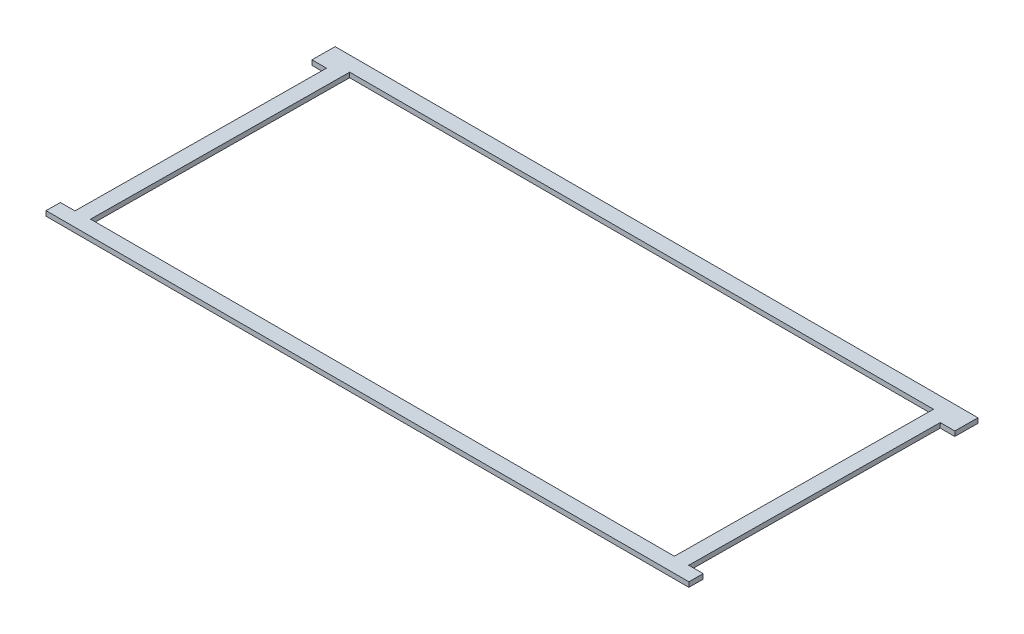
ISO-10303-21;
HEADER;
FILE_DESCRIPTION(('STEP AP214'),'2;1');
FILE_NAME('part.step','',(''),(''),'','','');
FILE_SCHEMA(('AUTOMOTIVE_DESIGN { 1 0 10303 214 1 1 1 1 }'));
ENDSEC;
DATA;
#1=APPLICATION_CONTEXT('core data for automotive mechanical design processes');
#2=APPLICATION_PROTOCOL_DEFINITION('international standard','automotive_design',2000,#1);
#3=PRODUCT_CONTEXT('',#1,'mechanical');
#4=PRODUCT('Part','Part','',(#3));
#5=PRODUCT_RELATED_PRODUCT_CATEGORY('part','',(#4));
#6=PRODUCT_DEFINITION_FORMATION('','',#4);
#7=PRODUCT_DEFINITION_CONTEXT('part definition',#1,'design');
#8=PRODUCT_DEFINITION('design','',#6,#7);
#9=PRODUCT_DEFINITION_SHAPE('','',#8);
#10=(LENGTH_UNIT() NAMED_UNIT(*) SI_UNIT(.MILLI.,.METRE.));
#11=(NAMED_UNIT(*) PLANE_ANGLE_UNIT() SI_UNIT($,.RADIAN.));
#12=(NAMED_UNIT(*) SI_UNIT($,.STERADIAN.) SOLID_ANGLE_UNIT());
#13=UNCERTAINTY_MEASURE_WITH_UNIT(LENGTH_MEASURE(1.E-05),#10,'distance_accuracy_value','');
#14=(GEOMETRIC_REPRESENTATION_CONTEXT(3) GLOBAL_UNCERTAINTY_ASSIGNED_CONTEXT((#13)) GLOBAL_UNIT_ASSIGNED_CONTEXT((#10,
#11,#12)) REPRESENTATION_CONTEXT('',''));
#15=CARTESIAN_POINT('',(0.,0.,0.));
#16=DIRECTION('',(0.,0.,1.));
#17=DIRECTION('',(1.,0.,0.));
#18=AXIS2_PLACEMENT_3D('',#15,#16,#17);
#19=CARTESIAN_POINT('',(417.672151763708,493.531931874623,538.470292866234));
#20=DIRECTION('',(0.,0.00872653549836411,0.999961923064171));
#21=DIRECTION('',(0.,-0.999961923064171,0.00872653549836411));
#22=AXIS2_PLACEMENT_3D('',#19,#20,#21);
#23=PLANE('',#22);
#24=DIRECTION('',(-1.,0.,0.));
#25=VECTOR('',#24,1.);
#26=CARTESIAN_POINT('',(417.672151763708,485.888029509417,538.53700019158));
#27=LINE('',#26,#25);
#28=CARTESIAN_POINT('',(417.672151763708,485.888029509417,538.53700019158));
#29=VERTEX_POINT('',#28);
#30=CARTESIAN_POINT('',(-506.582849543356,485.888029509417,538.537000191581));
#31=VERTEX_POINT('',#30);
#32=EDGE_CURVE('E219',#29,#31,#27,.T.);
#33=ORIENTED_EDGE('',*,*,#32,.F.);
#34=DIRECTION('',(0.,-0.999961923064171,0.00872653549836411));
#35=VECTOR('',#34,1.);
#36=CARTESIAN_POINT('',(417.672151763708,493.531931874623,538.470292866234));
#37=LINE('',#36,#35);
#38=CARTESIAN_POINT('',(417.672151763708,493.531931874623,538.470292866234));
#39=VERTEX_POINT('',#38);
#40=EDGE_CURVE('E38',#39,#29,#37,.T.);
#41=ORIENTED_EDGE('',*,*,#40,.F.);
#42=DIRECTION('',(-1.,0.,0.));
#43=VECTOR('',#42,1.);
#44=CARTESIAN_POINT('',(417.672151763708,493.531931874623,538.470292866234));
#45=LINE('',#44,#43);
#46=CARTESIAN_POINT('',(-506.582849543356,493.531931874623,538.470292866234));
#47=VERTEX_POINT('',#46);
#48=EDGE_CURVE('E156',#39,#47,#45,.T.);
#49=ORIENTED_EDGE('',*,*,#48,.T.);
#50=DIRECTION('',(0.,-0.999961923064171,0.00872653549836411));
#51=VECTOR('',#50,1.);
#52=CARTESIAN_POINT('',(-506.582849543356,493.531931874623,538.470292866234));
#53=LINE('',#52,#51);
#54=EDGE_CURVE('E10',#47,#31,#53,.T.);
#55=ORIENTED_EDGE('',*,*,#54,.T.);
#56=EDGE_LOOP('',(#33,#41,#49,#55));
#57=FACE_BOUND('',#56,.T.);
#58=ADVANCED_FACE('F16',(#57),#23,.T.);
#59=CARTESIAN_POINT('',(-506.582849543356,493.531931874623,538.470292866234));
#60=DIRECTION('',(1.,0.,0.));
#61=DIRECTION('',(0.,1.,0.));
#62=AXIS2_PLACEMENT_3D('',#59,#60,#61);
#63=PLANE('',#62);
#64=DIRECTION('',(0.,0.00872653549836411,0.999961923064171));
#65=VECTOR('',#64,1.);
#66=CARTESIAN_POINT('',(-506.582849543356,485.888029509417,538.537000191581));
#67=LINE('',#66,#65);
#68=CARTESIAN_POINT('',(-506.582849543356,489.468134341704,948.776380245287));
#69=VERTEX_POINT('',#68);
#70=EDGE_CURVE('E224',#31,#69,#67,.T.);
#71=ORIENTED_EDGE('',*,*,#70,.F.);
#72=ORIENTED_EDGE('',*,*,#54,.F.);
#73=DIRECTION('',(0.,0.00872653549836411,0.999961923064171));
#74=VECTOR('',#73,1.);
#75=CARTESIAN_POINT('',(-506.582849543356,493.531931874623,538.470292866234));
#76=LINE('',#75,#74);
#77=CARTESIAN_POINT('',(-506.582849543356,497.11203670691,948.70967291994));
#78=VERTEX_POINT('',#77);
#79=EDGE_CURVE('E152',#47,#78,#76,.T.);
#80=ORIENTED_EDGE('',*,*,#79,.T.);
#81=DIRECTION('',(0.,-0.999961923064171,0.00872653549836411));
#82=VECTOR('',#81,1.);
#83=CARTESIAN_POINT('',(-506.582849543356,497.11203670691,948.70967291994));
#84=LINE('',#83,#82);
#85=EDGE_CURVE('E29',#78,#69,#84,.T.);
#86=ORIENTED_EDGE('',*,*,#85,.T.);
#87=EDGE_LOOP('',(#71,#72,#80,#86));
#88=FACE_BOUND('',#87,.T.);
#89=ADVANCED_FACE('F153',(#88),#63,.T.);
#90=CARTESIAN_POINT('',(-506.582849543356,497.11203670691,948.70967291994));
#91=DIRECTION('',(0.,-0.00872653549836411,-0.999961923064171));
#92=DIRECTION('',(0.,0.999961923064171,-0.00872653549836411));
#93=AXIS2_PLACEMENT_3D('',#90,#91,#92);
#94=PLANE('',#93);
#95=DIRECTION('',(1.,0.,0.));
#96=VECTOR('',#95,1.);
#97=CARTESIAN_POINT('',(-506.582849543356,489.468134341704,948.776380245287));
#98=LINE('',#97,#96);
#99=CARTESIAN_POINT('',(417.672151763708,489.46813441786,948.776388971822));
#100=VERTEX_POINT('',#99);
#101=EDGE_CURVE('E146',#69,#100,#98,.T.);
#102=ORIENTED_EDGE('',*,*,#101,.F.);
#103=ORIENTED_EDGE('',*,*,#85,.F.);
#104=DIRECTION('',(1.,0.,0.));
#105=VECTOR('',#104,1.);
#106=CARTESIAN_POINT('',(-506.582849543356,497.11203670691,948.70967291994));
#107=LINE('',#106,#105);
#108=CARTESIAN_POINT('',(417.672151763708,497.112036783066,948.709681646475));
#109=VERTEX_POINT('',#108);
#110=EDGE_CURVE('E143',#78,#109,#107,.T.);
#111=ORIENTED_EDGE('',*,*,#110,.T.);
#112=CARTESIAN_POINT('',(417.672151763708,497.112036706911,948.70967291994));
#113=DIRECTION('',(0.,-0.999961923064172,0.00872653549836131));
#114=VECTOR('',#113,1.);
#115=LINE('',#112,#114);
#116=EDGE_CURVE('E90',#109,#100,#115,.T.);
#117=ORIENTED_EDGE('',*,*,#116,.T.);
#118=EDGE_LOOP('',(#102,#103,#111,#117));
#119=FACE_BOUND('',#118,.T.);
#120=ADVANCED_FACE('F141',(#119),#94,.T.);
#121=CARTESIAN_POINT('',(441.417150456643,497.120763242409,949.709634843005));
#122=DIRECTION('',(0.,-0.00872653549836411,-0.999961923064171));
#123=DIRECTION('',(0.,0.999961923064171,-0.00872653549836411));
#124=AXIS2_PLACEMENT_3D('',#121,#122,#123);
#125=PLANE('',#124);
#126=DIRECTION('',(1.,0.,0.));
#127=VECTOR('',#126,1.);
#128=CARTESIAN_POINT('',(441.417150456643,489.476860877203,949.776342168351));
#129=LINE('',#128,#127);
#130=CARTESIAN_POINT('',(441.417150456643,489.476860877203,949.776342168351));
#131=VERTEX_POINT('',#130);
#132=CARTESIAN_POINT('',(464.417150456643,489.476860877203,949.776342168351));
#133=VERTEX_POINT('',#132);
#134=EDGE_CURVE('E169',#131,#133,#129,.T.);
#135=ORIENTED_EDGE('',*,*,#134,.F.);
#136=CARTESIAN_POINT('',(441.417150456643,497.120763242409,949.709634843005));
#137=DIRECTION('',(0.,-0.999961923064172,0.00872653549836131));
#138=VECTOR('',#137,1.);
#139=LINE('',#136,#138);
#140=CARTESIAN_POINT('',(441.417150456643,497.120763242409,949.709634843005));
#141=VERTEX_POINT('',#140);
#142=EDGE_CURVE('E161',#141,#131,#139,.T.);
#143=ORIENTED_EDGE('',*,*,#142,.F.);
#144=DIRECTION('',(1.,0.,0.));
#145=VECTOR('',#144,1.);
#146=CARTESIAN_POINT('',(441.417150456643,497.120763242409,949.709634843005));
#147=LINE('',#146,#145);
#148=CARTESIAN_POINT('',(464.417150456643,497.120763242409,949.709634843005));
#149=VERTEX_POINT('',#148);
#150=EDGE_CURVE('E231',#141,#149,#147,.T.);
#151=ORIENTED_EDGE('',*,*,#150,.T.);
#152=DIRECTION('',(0.,-0.999961923064171,0.00872653549836411));
#153=VECTOR('',#152,1.);
#154=CARTESIAN_POINT('',(464.417150456643,497.120763242409,949.709634843005));
#155=LINE('',#154,#153);
#156=EDGE_CURVE('E102',#149,#133,#155,.T.);
#157=ORIENTED_EDGE('',*,*,#156,.T.);
#158=EDGE_LOOP('',(#135,#143,#151,#157));
#159=FACE_BOUND('',#158,.T.);
#160=ADVANCED_FACE('F18',(#159),#125,.T.);
#161=CARTESIAN_POINT('',(464.417150456643,497.120763242409,949.709634843005));
#162=DIRECTION('',(1.,0.,0.));
#163=DIRECTION('',(0.,1.,0.));
#164=AXIS2_PLACEMENT_3D('',#161,#162,#163);
#165=PLANE('',#164);
#166=DIRECTION('',(0.,0.00872653549836411,0.999961923064171));
#167=VECTOR('',#166,1.);
#168=CARTESIAN_POINT('',(464.417150456643,489.476860877203,949.776342168351));
#169=LINE('',#168,#167);
#170=CARTESIAN_POINT('',(464.417150456643,489.675345915707,972.520474801431));
#171=VERTEX_POINT('',#170);
#172=EDGE_CURVE('E172',#133,#171,#169,.T.);
#173=ORIENTED_EDGE('',*,*,#172,.F.);
#174=ORIENTED_EDGE('',*,*,#156,.F.);
#175=DIRECTION('',(0.,0.00872653549836411,0.999961923064171));
#176=VECTOR('',#175,1.);
#177=CARTESIAN_POINT('',(464.417150456643,497.120763242409,949.709634843005));
#178=LINE('',#177,#176);
#179=CARTESIAN_POINT('',(464.417150456643,497.319248280913,972.453767476084));
#180=VERTEX_POINT('',#179);
#181=EDGE_CURVE('E583',#149,#180,#178,.T.);
#182=ORIENTED_EDGE('',*,*,#181,.T.);
#183=DIRECTION('',(0.,-0.999961923064171,0.00872653549836411));
#184=VECTOR('',#183,1.);
#185=CARTESIAN_POINT('',(464.417150456643,497.319248280913,972.453767476084));
#186=LINE('',#185,#184);
#187=EDGE_CURVE('E250',#180,#171,#186,.T.);
#188=ORIENTED_EDGE('',*,*,#187,.T.);
#189=EDGE_LOOP('',(#173,#174,#182,#188));
#190=FACE_BOUND('',#189,.T.);
#191=ADVANCED_FACE('F466',(#190),#165,.T.);
#192=CARTESIAN_POINT('',(464.417150456643,497.319248280913,972.453767476084));
#193=DIRECTION('',(0.,0.00872653549836411,0.999961923064171));
#194=DIRECTION('',(0.,-0.999961923064171,0.00872653549836411));
#195=AXIS2_PLACEMENT_3D('',#192,#193,#194);
#196=PLANE('',#195);
#197=DIRECTION('',(-1.,0.,0.));
#198=VECTOR('',#197,1.);
#199=CARTESIAN_POINT('',(464.417150456643,489.675345915707,972.520474801431));
#200=LINE('',#199,#198);
#201=CARTESIAN_POINT('',(-553.327848236291,489.675345915707,972.52047480143));
#202=VERTEX_POINT('',#201);
#203=EDGE_CURVE('E177',#171,#202,#200,.T.);
#204=ORIENTED_EDGE('',*,*,#203,.F.);
#205=ORIENTED_EDGE('',*,*,#187,.F.);
#206=DIRECTION('',(-1.,0.,0.));
#207=VECTOR('',#206,1.);
#208=CARTESIAN_POINT('',(464.417150456643,497.319248280913,972.453767476084));
#209=LINE('',#208,#207);
#210=CARTESIAN_POINT('',(-553.327848236291,497.319248280913,972.453767476084));
#211=VERTEX_POINT('',#210);
#212=EDGE_CURVE('E407',#180,#211,#209,.T.);
#213=ORIENTED_EDGE('',*,*,#212,.T.);
#214=DIRECTION('',(0.,-0.999961923064171,0.00872653549836411));
#215=VECTOR('',#214,1.);
#216=CARTESIAN_POINT('',(-553.327848236291,497.319248280913,972.453767476084));
#217=LINE('',#216,#215);
#218=EDGE_CURVE('E248',#211,#202,#217,.T.);
#219=ORIENTED_EDGE('',*,*,#218,.T.);
#220=EDGE_LOOP('',(#204,#205,#213,#219));
#221=FACE_BOUND('',#220,.T.);
#222=ADVANCED_FACE('F472',(#221),#196,.T.);
#223=CARTESIAN_POINT('',(-553.327848236291,497.319248280913,972.453767476084));
#224=DIRECTION('',(-1.,0.,0.));
#225=DIRECTION('',(0.,-1.,0.));
#226=AXIS2_PLACEMENT_3D('',#223,#224,#225);
#227=PLANE('',#226);
#228=DIRECTION('',(0.,-0.00872653549836411,-0.999961923064171));
#229=VECTOR('',#228,1.);
#230=CARTESIAN_POINT('',(-553.327848236291,489.675345915707,972.52047480143));
#231=LINE('',#230,#229);
#232=CARTESIAN_POINT('',(-553.327848236291,489.476860877203,949.776342168351));
#233=VERTEX_POINT('',#232);
#234=EDGE_CURVE('E180',#202,#233,#231,.T.);
#235=ORIENTED_EDGE('',*,*,#234,.F.);
#236=ORIENTED_EDGE('',*,*,#218,.F.);
#237=DIRECTION('',(0.,-0.00872653549836411,-0.999961923064171));
#238=VECTOR('',#237,1.);
#239=CARTESIAN_POINT('',(-553.327848236291,497.319248280913,972.453767476084));
#240=LINE('',#239,#238);
#241=CARTESIAN_POINT('',(-553.327848236291,497.120763242409,949.709634843004));
#242=VERTEX_POINT('',#241);
#243=EDGE_CURVE('E404',#211,#242,#240,.T.);
#244=ORIENTED_EDGE('',*,*,#243,.T.);
#245=DIRECTION('',(0.,-0.999961923064171,0.00872653549836411));
#246=VECTOR('',#245,1.);
#247=CARTESIAN_POINT('',(-553.327848236291,497.120763242409,949.709634843004));
#248=LINE('',#247,#246);
#249=EDGE_CURVE('E246',#242,#233,#248,.T.);
#250=ORIENTED_EDGE('',*,*,#249,.T.);
#251=EDGE_LOOP('',(#235,#236,#244,#250));
#252=FACE_BOUND('',#251,.T.);
#253=ADVANCED_FACE('F400',(#252),#227,.T.);
#254=CARTESIAN_POINT('',(-553.327848236291,497.120763242409,949.709634843004));
#255=DIRECTION('',(0.,-0.00872653549836411,-0.999961923064171));
#256=DIRECTION('',(0.,0.999961923064171,-0.00872653549836411));
#257=AXIS2_PLACEMENT_3D('',#254,#255,#256);
#258=PLANE('',#257);
#259=DIRECTION('',(1.,0.,0.));
#260=VECTOR('',#259,1.);
#261=CARTESIAN_POINT('',(-553.327848236291,489.476860877203,949.776342168351));
#262=LINE('',#261,#260);
#263=CARTESIAN_POINT('',(-530.327848236292,489.476860953358,949.776350894886));
#264=VERTEX_POINT('',#263);
#265=EDGE_CURVE('E183',#233,#264,#262,.T.);
#266=ORIENTED_EDGE('',*,*,#265,.F.);
#267=ORIENTED_EDGE('',*,*,#249,.F.);
#268=DIRECTION('',(1.,0.,0.));
#269=VECTOR('',#268,1.);
#270=CARTESIAN_POINT('',(-553.327848236291,497.120763242409,949.709634843004));
#271=LINE('',#270,#269);
#272=CARTESIAN_POINT('',(-530.327848236292,497.120763318564,949.70964356954));
#273=VERTEX_POINT('',#272);
#274=EDGE_CURVE('E392',#242,#273,#271,.T.);
#275=ORIENTED_EDGE('',*,*,#274,.T.);
#276=CARTESIAN_POINT('',(-530.327848236292,497.120763242409,949.709634843004));
#277=DIRECTION('',(0.,-0.999961923064172,0.00872653549836131));
#278=VECTOR('',#277,1.);
#279=LINE('',#276,#278);
#280=EDGE_CURVE('E245',#273,#264,#279,.T.);
#281=ORIENTED_EDGE('',*,*,#280,.T.);
#282=EDGE_LOOP('',(#266,#267,#275,#281));
#283=FACE_BOUND('',#282,.T.);
#284=ADVANCED_FACE('F390',(#283),#258,.T.);
#285=CARTESIAN_POINT('',(-530.327848236292,497.120763318564,949.70964356954));
#286=DIRECTION('',(-1.,0.,0.));
#287=DIRECTION('',(0.,0.,1.));
#288=AXIS2_PLACEMENT_3D('',#285,#286,#287);
#289=PLANE('',#288);
#290=DIRECTION('',(0.,-0.00872653549836411,-0.999961923064171));
#291=VECTOR('',#290,1.);
#292=CARTESIAN_POINT('',(-530.327848236292,489.476860953358,949.776350894886));
#293=LINE('',#292,#291);
#294=CARTESIAN_POINT('',(-530.327848236292,486.001474470895,551.536505191415));
#295=VERTEX_POINT('',#294);
#296=EDGE_CURVE('E186',#264,#295,#293,.T.);
#297=ORIENTED_EDGE('',*,*,#296,.F.);
#298=ORIENTED_EDGE('',*,*,#280,.F.);
#299=DIRECTION('',(0.,-0.00872653549836411,-0.999961923064171));
#300=VECTOR('',#299,1.);
#301=CARTESIAN_POINT('',(-530.327848236292,497.120763318564,949.70964356954));
#302=LINE('',#301,#300);
#303=CARTESIAN_POINT('',(-530.327848236292,493.645376836102,551.469797866068));
#304=VERTEX_POINT('',#303);
#305=EDGE_CURVE('E411',#273,#304,#302,.T.);
#306=ORIENTED_EDGE('',*,*,#305,.T.);
#307=DIRECTION('',(0.,-0.999961923064171,0.00872653549836411));
#308=VECTOR('',#307,1.);
#309=CARTESIAN_POINT('',(-530.327848236292,493.645376836102,551.469797866068));
#310=LINE('',#309,#308);
#311=EDGE_CURVE('E243',#304,#295,#310,.T.);
#312=ORIENTED_EDGE('',*,*,#311,.T.);
#313=EDGE_LOOP('',(#297,#298,#306,#312));
#314=FACE_BOUND('',#313,.T.);
#315=ADVANCED_FACE('F365',(#314),#289,.T.);
#316=CARTESIAN_POINT('',(-530.327848236292,493.645376836102,551.469797866068));
#317=DIRECTION('',(0.,0.00872653549836411,0.999961923064171));
#318=DIRECTION('',(0.,-0.999961923064171,0.00872653549836411));
#319=AXIS2_PLACEMENT_3D('',#316,#317,#318);
#320=PLANE('',#319);
#321=DIRECTION('',(-1.,0.,0.));
#322=VECTOR('',#321,1.);
#323=CARTESIAN_POINT('',(-530.327848236292,486.001474470895,551.536505191415));
#324=LINE('',#323,#322);
#325=CARTESIAN_POINT('',(-553.327848236292,486.001474547051,551.53651391795));
#326=VERTEX_POINT('',#325);
#327=EDGE_CURVE('E191',#295,#326,#324,.T.);
#328=ORIENTED_EDGE('',*,*,#327,.F.);
#329=ORIENTED_EDGE('',*,*,#311,.F.);
#330=DIRECTION('',(-1.,0.,0.));
#331=VECTOR('',#330,1.);
#332=CARTESIAN_POINT('',(-530.327848236292,493.645376836102,551.469797866068));
#333=LINE('',#332,#331);
#334=CARTESIAN_POINT('',(-553.327848236292,493.645376912257,551.469806592604));
#335=VERTEX_POINT('',#334);
#336=EDGE_CURVE('E413',#304,#335,#333,.T.);
#337=ORIENTED_EDGE('',*,*,#336,.T.);
#338=CARTESIAN_POINT('',(-553.327848236292,493.645376836102,551.469797866068));
#339=DIRECTION('',(0.,-0.999961923064172,0.00872653549836131));
#340=VECTOR('',#339,1.);
#341=LINE('',#338,#340);
#342=EDGE_CURVE('E242',#335,#326,#341,.T.);
#343=ORIENTED_EDGE('',*,*,#342,.T.);
#344=EDGE_LOOP('',(#328,#329,#337,#343));
#345=FACE_BOUND('',#344,.T.);
#346=ADVANCED_FACE('F361',(#345),#320,.T.);
#347=CARTESIAN_POINT('',(-553.327848236292,493.645376912257,551.469806592604));
#348=DIRECTION('',(-1.,0.,0.));
#349=DIRECTION('',(0.,-1.,0.));
#350=AXIS2_PLACEMENT_3D('',#347,#348,#349);
#351=PLANE('',#350);
#352=DIRECTION('',(0.,-0.00872653549836411,-0.999961923064171));
#353=VECTOR('',#352,1.);
#354=CARTESIAN_POINT('',(-553.327848236292,486.001474547051,551.53651391795));
#355=LINE('',#354,#353);
#356=CARTESIAN_POINT('',(-553.327848236292,485.680817935414,514.792905635436));
#357=VERTEX_POINT('',#356);
#358=EDGE_CURVE('E196',#326,#357,#355,.T.);
#359=ORIENTED_EDGE('',*,*,#358,.F.);
#360=ORIENTED_EDGE('',*,*,#342,.F.);
#361=DIRECTION('',(0.,-0.00872653549836411,-0.999961923064171));
#362=VECTOR('',#361,1.);
#363=CARTESIAN_POINT('',(-553.327848236292,493.645376912257,551.469806592604));
#364=LINE('',#363,#362);
#365=CARTESIAN_POINT('',(-553.327848236292,493.32472030062,514.72619831009));
#366=VERTEX_POINT('',#365);
#367=EDGE_CURVE('E422',#335,#366,#364,.T.);
#368=ORIENTED_EDGE('',*,*,#367,.T.);
#369=DIRECTION('',(0.,-0.999961923064171,0.00872653549836411));
#370=VECTOR('',#369,1.);
#371=CARTESIAN_POINT('',(-553.327848236292,493.32472030062,514.72619831009));
#372=LINE('',#371,#370);
#373=EDGE_CURVE('E240',#366,#357,#372,.T.);
#374=ORIENTED_EDGE('',*,*,#373,.T.);
#375=EDGE_LOOP('',(#359,#360,#368,#374));
#376=FACE_BOUND('',#375,.T.);
#377=ADVANCED_FACE('F351',(#376),#351,.T.);
#378=CARTESIAN_POINT('',(-553.327848236292,493.324720300621,514.72619831009));
#379=DIRECTION('',(0.,-0.00872653549836411,-0.999961923064171));
#380=DIRECTION('',(0.,0.999961923064171,-0.00872653549836411));
#381=AXIS2_PLACEMENT_3D('',#378,#379,#380);
#382=PLANE('',#381);
#383=DIRECTION('',(1.,0.,0.));
#384=VECTOR('',#383,1.);
#385=CARTESIAN_POINT('',(-553.327848236292,485.680817935414,514.792905635436));
#386=LINE('',#385,#384);
#387=CARTESIAN_POINT('',(464.417150456642,485.680817935414,514.792905635436));
#388=VERTEX_POINT('',#387);
#389=EDGE_CURVE('E201',#357,#388,#386,.T.);
#390=ORIENTED_EDGE('',*,*,#389,.F.);
#391=ORIENTED_EDGE('',*,*,#373,.F.);
#392=DIRECTION('',(1.,0.,0.));
#393=VECTOR('',#392,1.);
#394=CARTESIAN_POINT('',(-553.327848236292,493.324720300621,514.72619831009));
#395=LINE('',#394,#393);
#396=CARTESIAN_POINT('',(464.417150456642,493.324720300621,514.726198310089));
#397=VERTEX_POINT('',#396);
#398=EDGE_CURVE('E426',#366,#397,#395,.T.);
#399=ORIENTED_EDGE('',*,*,#398,.T.);
#400=DIRECTION('',(0.,-0.999961923064171,0.00872653549836411));
#401=VECTOR('',#400,1.);
#402=CARTESIAN_POINT('',(464.417150456642,493.324720300621,514.726198310089));
#403=LINE('',#402,#401);
#404=EDGE_CURVE('E238',#397,#388,#403,.T.);
#405=ORIENTED_EDGE('',*,*,#404,.T.);
#406=EDGE_LOOP('',(#390,#391,#399,#405));
#407=FACE_BOUND('',#406,.T.);
#408=ADVANCED_FACE('F360',(#407),#382,.T.);
#409=CARTESIAN_POINT('',(464.417150456643,493.324720300621,514.726198310089));
#410=DIRECTION('',(1.,0.,0.));
#411=DIRECTION('',(0.,0.,-1.));
#412=AXIS2_PLACEMENT_3D('',#409,#410,#411);
#413=PLANE('',#412);
#414=DIRECTION('',(0.,0.00872653549836411,0.999961923064171));
#415=VECTOR('',#414,1.);
#416=CARTESIAN_POINT('',(464.417150456643,485.680817935414,514.792905635436));
#417=LINE('',#416,#415);
#418=CARTESIAN_POINT('',(464.417150456642,486.001474470896,551.536505191415));
#419=VERTEX_POINT('',#418);
#420=EDGE_CURVE('E206',#388,#419,#417,.T.);
#421=ORIENTED_EDGE('',*,*,#420,.F.);
#422=ORIENTED_EDGE('',*,*,#404,.F.);
#423=DIRECTION('',(0.,0.00872653549836411,0.999961923064171));
#424=VECTOR('',#423,1.);
#425=CARTESIAN_POINT('',(464.417150456643,493.324720300621,514.726198310089));
#426=LINE('',#425,#424);
#427=CARTESIAN_POINT('',(464.417150456642,493.645376836102,551.469797866069));
#428=VERTEX_POINT('',#427);
#429=EDGE_CURVE('E431',#397,#428,#426,.T.);
#430=ORIENTED_EDGE('',*,*,#429,.T.);
#431=CARTESIAN_POINT('',(464.417150456643,493.645376836102,551.469797866069));
#432=DIRECTION('',(0.,-0.999961923064172,0.00872653549836131));
#433=VECTOR('',#432,1.);
#434=LINE('',#431,#433);
#435=EDGE_CURVE('E237',#428,#419,#434,.T.);
#436=ORIENTED_EDGE('',*,*,#435,.T.);
#437=EDGE_LOOP('',(#421,#422,#430,#436));
#438=FACE_BOUND('',#437,.T.);
#439=ADVANCED_FACE('F316',(#438),#413,.T.);
#440=CARTESIAN_POINT('',(464.417150456642,493.645376836102,551.469797866069));
#441=DIRECTION('',(0.,0.00872653549836411,0.999961923064171));
#442=DIRECTION('',(0.,-0.999961923064171,0.00872653549836411));
#443=AXIS2_PLACEMENT_3D('',#440,#441,#442);
#444=PLANE('',#443);
#445=DIRECTION('',(-1.,0.,0.));
#446=VECTOR('',#445,1.);
#447=CARTESIAN_POINT('',(464.417150456642,486.001474470896,551.536505191415));
#448=LINE('',#447,#446);
#449=CARTESIAN_POINT('',(441.417150456643,486.001474470896,551.536505191415));
#450=VERTEX_POINT('',#449);
#451=EDGE_CURVE('E209',#419,#450,#448,.T.);
#452=ORIENTED_EDGE('',*,*,#451,.F.);
#453=ORIENTED_EDGE('',*,*,#435,.F.);
#454=DIRECTION('',(-1.,0.,0.));
#455=VECTOR('',#454,1.);
#456=CARTESIAN_POINT('',(464.417150456642,493.645376836102,551.469797866069));
#457=LINE('',#456,#455);
#458=CARTESIAN_POINT('',(441.417150456643,493.645376836102,551.469797866069));
#459=VERTEX_POINT('',#458);
#460=EDGE_CURVE('E433',#428,#459,#457,.T.);
#461=ORIENTED_EDGE('',*,*,#460,.T.);
#462=DIRECTION('',(0.,-0.999961923064171,0.00872653549836411));
#463=VECTOR('',#462,1.);
#464=CARTESIAN_POINT('',(441.417150456643,493.645376836102,551.469797866069));
#465=LINE('',#464,#463);
#466=EDGE_CURVE('E235',#459,#450,#465,.T.);
#467=ORIENTED_EDGE('',*,*,#466,.T.);
#468=EDGE_LOOP('',(#452,#453,#461,#467));
#469=FACE_BOUND('',#468,.T.);
#470=ADVANCED_FACE('F312',(#469),#444,.T.);
#471=CARTESIAN_POINT('',(441.417150456643,493.645376836102,551.469797866069));
#472=DIRECTION('',(1.,0.,0.));
#473=DIRECTION('',(0.,1.,0.));
#474=AXIS2_PLACEMENT_3D('',#471,#472,#473);
#475=PLANE('',#474);
#476=DIRECTION('',(0.,0.00872653549836411,0.999961923064171));
#477=VECTOR('',#476,1.);
#478=CARTESIAN_POINT('',(441.417150456643,486.001474470896,551.536505191415));
#479=LINE('',#478,#477);
#480=EDGE_CURVE('E214',#450,#131,#479,.T.);
#481=ORIENTED_EDGE('',*,*,#480,.F.);
#482=ORIENTED_EDGE('',*,*,#466,.F.);
#483=DIRECTION('',(0.,0.00872653549836411,0.999961923064171));
#484=VECTOR('',#483,1.);
#485=CARTESIAN_POINT('',(441.417150456643,493.645376836102,551.469797866069));
#486=LINE('',#485,#484);
#487=EDGE_CURVE('E438',#459,#141,#486,.T.);
#488=ORIENTED_EDGE('',*,*,#487,.T.);
#489=ORIENTED_EDGE('',*,*,#142,.T.);
#490=EDGE_LOOP('',(#481,#482,#488,#489));
#491=FACE_BOUND('',#490,.T.);
#492=ADVANCED_FACE('F268',(#491),#475,.T.);
#493=CARTESIAN_POINT('',(417.672151763708,497.112036783066,948.709681646475));
#494=DIRECTION('',(-1.,0.,0.));
#495=DIRECTION('',(0.,-1.,0.));
#496=AXIS2_PLACEMENT_3D('',#493,#494,#495);
#497=PLANE('',#496);
#498=DIRECTION('',(0.,-0.00872653549836411,-0.999961923064171));
#499=VECTOR('',#498,1.);
#500=CARTESIAN_POINT('',(417.672151763708,489.46813441786,948.776388971822));
#501=LINE('',#500,#499);
#502=EDGE_CURVE('E227',#100,#29,#501,.T.);
#503=ORIENTED_EDGE('',*,*,#502,.F.);
#504=ORIENTED_EDGE('',*,*,#116,.F.);
#505=DIRECTION('',(0.,-0.00872653549836411,-0.999961923064171));
#506=VECTOR('',#505,1.);
#507=CARTESIAN_POINT('',(417.672151763708,497.112036783066,948.709681646475));
#508=LINE('',#507,#506);
#509=EDGE_CURVE('E159',#109,#39,#508,.T.);
#510=ORIENTED_EDGE('',*,*,#509,.T.);
#511=ORIENTED_EDGE('',*,*,#40,.T.);
#512=EDGE_LOOP('',(#503,#504,#510,#511));
#513=FACE_BOUND('',#512,.T.);
#514=ADVANCED_FACE('F258',(#513),#497,.T.);
#515=CARTESIAN_POINT('',(-44.4553488898243,495.654465293254,781.688532161832));
#516=DIRECTION('',(0.,-0.999961923064171,0.00872653549836411));
#517=DIRECTION('',(1.,0.,0.));
#518=AXIS2_PLACEMENT_3D('',#515,#516,#517);
#519=PLANE('',#518);
#520=ORIENTED_EDGE('',*,*,#150,.F.);
#521=ORIENTED_EDGE('',*,*,#487,.F.);
#522=ORIENTED_EDGE('',*,*,#460,.F.);
#523=ORIENTED_EDGE('',*,*,#429,.F.);
#524=ORIENTED_EDGE('',*,*,#398,.F.);
#525=ORIENTED_EDGE('',*,*,#367,.F.);
#526=ORIENTED_EDGE('',*,*,#336,.F.);
#527=ORIENTED_EDGE('',*,*,#305,.F.);
#528=ORIENTED_EDGE('',*,*,#274,.F.);
#529=ORIENTED_EDGE('',*,*,#243,.F.);
#530=ORIENTED_EDGE('',*,*,#212,.F.);
#531=ORIENTED_EDGE('',*,*,#181,.F.);
#532=EDGE_LOOP('',(#520,#521,#522,#523,#524,#525,#526,#527,#528,#529,#530,#531));
#533=FACE_BOUND('',#532,.T.);
#534=ORIENTED_EDGE('',*,*,#48,.F.);
#535=ORIENTED_EDGE('',*,*,#509,.F.);
#536=ORIENTED_EDGE('',*,*,#110,.F.);
#537=ORIENTED_EDGE('',*,*,#79,.F.);
#538=EDGE_LOOP('',(#534,#535,#536,#537));
#539=FACE_BOUND('',#538,.T.);
#540=ADVANCED_FACE('F158',(#533,#539),#519,.F.);
#541=CARTESIAN_POINT('',(-44.4553488898243,488.010562928048,781.755239487178));
#542=DIRECTION('',(0.,-0.999961923064171,0.00872653549836411));
#543=DIRECTION('',(1.,0.,0.));
#544=AXIS2_PLACEMENT_3D('',#541,#542,#543);
#545=PLANE('',#544);
#546=ORIENTED_EDGE('',*,*,#134,.T.);
#547=ORIENTED_EDGE('',*,*,#172,.T.);
#548=ORIENTED_EDGE('',*,*,#203,.T.);
#549=ORIENTED_EDGE('',*,*,#234,.T.);
#550=ORIENTED_EDGE('',*,*,#265,.T.);
#551=ORIENTED_EDGE('',*,*,#296,.T.);
#552=ORIENTED_EDGE('',*,*,#327,.T.);
#553=ORIENTED_EDGE('',*,*,#358,.T.);
#554=ORIENTED_EDGE('',*,*,#389,.T.);
#555=ORIENTED_EDGE('',*,*,#420,.T.);
#556=ORIENTED_EDGE('',*,*,#451,.T.);
#557=ORIENTED_EDGE('',*,*,#480,.T.);
#558=EDGE_LOOP('',(#546,#547,#548,#549,#550,#551,#552,#553,#554,#555,#556,#557));
#559=FACE_BOUND('',#558,.T.);
#560=ORIENTED_EDGE('',*,*,#32,.T.);
#561=ORIENTED_EDGE('',*,*,#70,.T.);
#562=ORIENTED_EDGE('',*,*,#101,.T.);
#563=ORIENTED_EDGE('',*,*,#502,.T.);
#564=EDGE_LOOP('',(#560,#561,#562,#563));
#565=FACE_BOUND('',#564,.T.);
#566=ADVANCED_FACE('F269',(#559,#565),#545,.T.);
#567=CLOSED_SHELL('',(#58,#89,#120,#160,#191,#222,#253,#284,#315,#346,#377,#408,#439,#470,#492,
#514,#540,#566));
#568=MANIFOLD_SOLID_BREP('B1',#567);
#569=ADVANCED_BREP_SHAPE_REPRESENTATION('',(#18,#568),#14);
#570=SHAPE_DEFINITION_REPRESENTATION(#9,#569);
ENDSEC;
END-ISO-10303-21;
